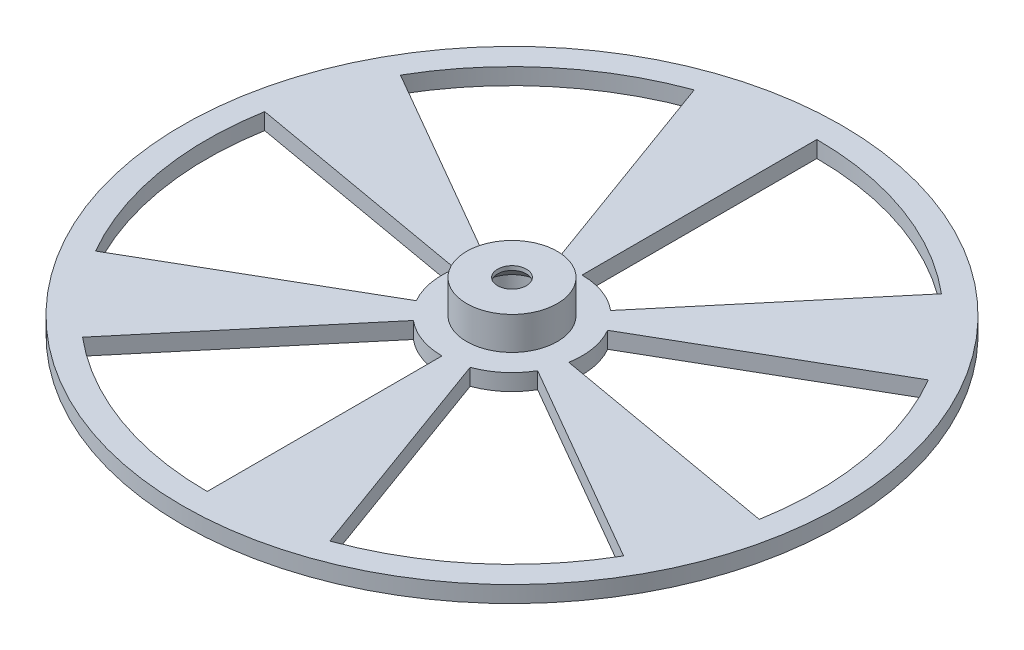
ISO-10303-21;
HEADER;
FILE_DESCRIPTION(('STEP AP214'),'2;1');
FILE_NAME('part.step','',(''),(''),'','','');
FILE_SCHEMA(('AUTOMOTIVE_DESIGN { 1 0 10303 214 1 1 1 1 }'));
ENDSEC;
DATA;
#1=APPLICATION_CONTEXT('core data for automotive mechanical design processes');
#2=APPLICATION_PROTOCOL_DEFINITION('international standard','automotive_design',2000,#1);
#3=PRODUCT_CONTEXT('',#1,'mechanical');
#4=PRODUCT('Part','Part','',(#3));
#5=PRODUCT_RELATED_PRODUCT_CATEGORY('part','',(#4));
#6=PRODUCT_DEFINITION_FORMATION('','',#4);
#7=PRODUCT_DEFINITION_CONTEXT('part definition',#1,'design');
#8=PRODUCT_DEFINITION('design','',#6,#7);
#9=PRODUCT_DEFINITION_SHAPE('','',#8);
#10=(LENGTH_UNIT() NAMED_UNIT(*) SI_UNIT(.MILLI.,.METRE.));
#11=(NAMED_UNIT(*) PLANE_ANGLE_UNIT() SI_UNIT($,.RADIAN.));
#12=(NAMED_UNIT(*) SI_UNIT($,.STERADIAN.) SOLID_ANGLE_UNIT());
#13=UNCERTAINTY_MEASURE_WITH_UNIT(LENGTH_MEASURE(1.E-05),#10,'distance_accuracy_value','');
#14=(GEOMETRIC_REPRESENTATION_CONTEXT(3) GLOBAL_UNCERTAINTY_ASSIGNED_CONTEXT((#13)) GLOBAL_UNIT_ASSIGNED_CONTEXT((#10,
#11,#12)) REPRESENTATION_CONTEXT('',''));
#15=CARTESIAN_POINT('',(0.,0.,0.));
#16=DIRECTION('',(0.,0.,1.));
#17=DIRECTION('',(1.,0.,0.));
#18=AXIS2_PLACEMENT_3D('',#15,#16,#17);
#19=CARTESIAN_POINT('',(0.,0.,0.));
#20=DIRECTION('',(0.,1.,0.));
#21=DIRECTION('',(0.,0.,1.));
#22=AXIS2_PLACEMENT_3D('',#19,#20,#21);
#23=CYLINDRICAL_SURFACE('',#22,1.75);
#24=CARTESIAN_POINT('',(0.,5.50000000000001,0.));
#25=DIRECTION('',(0.,-1.,0.));
#26=DIRECTION('',(0.,0.,-1.));
#27=AXIS2_PLACEMENT_3D('',#24,#25,#26);
#28=CIRCLE('',#27,1.75);
#29=CARTESIAN_POINT('',(0.,5.50000000000001,-1.75));
#30=VERTEX_POINT('',#29);
#31=EDGE_CURVE('E50',#30,#30,#28,.T.);
#32=ORIENTED_EDGE('',*,*,#31,.T.);
#33=EDGE_LOOP('',(#32));
#34=FACE_BOUND('',#33,.T.);
#35=CARTESIAN_POINT('',(0.,6.,0.));
#36=DIRECTION('',(0.,1.,0.));
#37=DIRECTION('',(0.,0.,1.));
#38=AXIS2_PLACEMENT_3D('',#35,#36,#37);
#39=CIRCLE('',#38,1.75);
#40=CARTESIAN_POINT('',(0.,6.,1.75));
#41=VERTEX_POINT('',#40);
#42=EDGE_CURVE('E478',#41,#41,#39,.T.);
#43=ORIENTED_EDGE('',*,*,#42,.T.);
#44=EDGE_LOOP('',(#43));
#45=FACE_BOUND('',#44,.T.);
#46=ADVANCED_FACE('F40',(#34,#45),#23,.F.);
#47=CARTESIAN_POINT('',(0.,2.,0.));
#48=DIRECTION('',(0.,-1.,0.));
#49=DIRECTION('',(0.,0.,-1.));
#50=AXIS2_PLACEMENT_3D('',#47,#48,#49);
#51=CYLINDRICAL_SURFACE('',#50,40.);
#52=CARTESIAN_POINT('',(0.,2.,0.));
#53=DIRECTION('',(0.,1.,0.));
#54=DIRECTION('',(0.,0.,1.));
#55=AXIS2_PLACEMENT_3D('',#52,#53,#54);
#56=CIRCLE('',#55,40.);
#57=CARTESIAN_POINT('',(0.,2.,40.));
#58=VERTEX_POINT('',#57);
#59=EDGE_CURVE('E491',#58,#58,#56,.T.);
#60=ORIENTED_EDGE('',*,*,#59,.F.);
#61=EDGE_LOOP('',(#60));
#62=FACE_BOUND('',#61,.T.);
#63=CARTESIAN_POINT('',(0.,0.,0.));
#64=DIRECTION('',(0.,1.,0.));
#65=DIRECTION('',(0.,0.,1.));
#66=AXIS2_PLACEMENT_3D('',#63,#64,#65);
#67=CIRCLE('',#66,40.);
#68=CARTESIAN_POINT('',(0.,0.,40.));
#69=VERTEX_POINT('',#68);
#70=EDGE_CURVE('E487',#69,#69,#67,.T.);
#71=ORIENTED_EDGE('',*,*,#70,.T.);
#72=EDGE_LOOP('',(#71));
#73=FACE_BOUND('',#72,.T.);
#74=ADVANCED_FACE('F523',(#62,#73),#51,.T.);
#75=CARTESIAN_POINT('',(0.,2.,0.));
#76=DIRECTION('',(0.,1.,0.));
#77=DIRECTION('',(0.,0.,1.));
#78=AXIS2_PLACEMENT_3D('',#75,#76,#77);
#79=PLANE('',#78);
#80=CARTESIAN_POINT('',(0.,2.,0.));
#81=DIRECTION('',(0.,-1.,0.));
#82=DIRECTION('',(0.,0.,1.));
#83=AXIS2_PLACEMENT_3D('',#80,#81,#82);
#84=CIRCLE('',#83,8.5);
#85=CARTESIAN_POINT('',(0.,2.,8.5));
#86=VERTEX_POINT('',#85);
#87=CARTESIAN_POINT('',(-5.46369468233555,2.,6.51137776651135));
#88=VERTEX_POINT('',#87);
#89=EDGE_CURVE('E57',#86,#88,#84,.T.);
#90=ORIENTED_EDGE('',*,*,#89,.F.);
#91=DIRECTION('',(0.,0.,-1.));
#92=VECTOR('',#91,1.);
#93=CARTESIAN_POINT('',(0.,2.,8.5));
#94=LINE('',#93,#92);
#95=CARTESIAN_POINT('',(-2.58369619074392E-13,2.,37.));
#96=VERTEX_POINT('',#95);
#97=EDGE_CURVE('E305',#96,#86,#94,.T.);
#98=ORIENTED_EDGE('',*,*,#97,.F.);
#99=CARTESIAN_POINT('',(0.,2.,0.));
#100=DIRECTION('',(0.,1.,0.));
#101=DIRECTION('',(0.,0.,1.));
#102=AXIS2_PLACEMENT_3D('',#99,#100,#101);
#103=CIRCLE('',#102,37.);
#104=CARTESIAN_POINT('',(-23.7831415584018,2.,28.3436443954023));
#105=VERTEX_POINT('',#104);
#106=EDGE_CURVE('E324',#105,#96,#103,.T.);
#107=ORIENTED_EDGE('',*,*,#106,.F.);
#108=DIRECTION('',(-0.642787609686535,0.,0.766044443118982));
#109=VECTOR('',#108,1.);
#110=CARTESIAN_POINT('',(-23.7831415584018,2.,28.3436443954023));
#111=LINE('',#110,#109);
#112=EDGE_CURVE('E320',#88,#105,#111,.T.);
#113=ORIENTED_EDGE('',*,*,#112,.F.);
#114=EDGE_LOOP('',(#90,#98,#107,#113));
#115=FACE_BOUND('',#114,.T.);
#116=CARTESIAN_POINT('',(0.,2.,0.));
#117=DIRECTION('',(0.,-1.,0.));
#118=DIRECTION('',(0.,0.,1.));
#119=AXIS2_PLACEMENT_3D('',#116,#117,#118);
#120=CIRCLE('',#119,8.5);
#121=CARTESIAN_POINT('',(-7.36121593216777,2.,4.24999999999993));
#122=VERTEX_POINT('',#121);
#123=CARTESIAN_POINT('',(-8.37086590060378,2.,-1.47600951016885));
#124=VERTEX_POINT('',#123);
#125=EDGE_CURVE('E65',#122,#124,#120,.T.);
#126=ORIENTED_EDGE('',*,*,#125,.F.);
#127=DIRECTION('',(0.866025403784443,0.,-0.499999999999992));
#128=VECTOR('',#127,1.);
#129=CARTESIAN_POINT('',(-7.36121593216777,2.,4.24999999999993));
#130=LINE('',#129,#128);
#131=CARTESIAN_POINT('',(-32.0429399400244,2.,18.4999999999997));
#132=VERTEX_POINT('',#131);
#133=EDGE_CURVE('E263',#132,#122,#130,.T.);
#134=ORIENTED_EDGE('',*,*,#133,.F.);
#135=CARTESIAN_POINT('',(0.,2.,0.));
#136=DIRECTION('',(0.,1.,0.));
#137=DIRECTION('',(0.,0.,1.));
#138=AXIS2_PLACEMENT_3D('',#135,#136,#137);
#139=CIRCLE('',#138,37.);
#140=CARTESIAN_POINT('',(-36.4378868614517,2.,-6.42498257367619));
#141=VERTEX_POINT('',#140);
#142=EDGE_CURVE('E282',#141,#132,#139,.T.);
#143=ORIENTED_EDGE('',*,*,#142,.F.);
#144=DIRECTION('',(-0.984807753012209,0.,-0.173648177666924));
#145=VECTOR('',#144,1.);
#146=CARTESIAN_POINT('',(-36.4378868614517,2.,-6.42498257367619));
#147=LINE('',#146,#145);
#148=EDGE_CURVE('E278',#124,#141,#147,.T.);
#149=ORIENTED_EDGE('',*,*,#148,.F.);
#150=EDGE_LOOP('',(#126,#134,#143,#149));
#151=FACE_BOUND('',#150,.T.);
#152=CARTESIAN_POINT('',(0.,2.,0.));
#153=DIRECTION('',(0.,-1.,0.));
#154=DIRECTION('',(0.,0.,1.));
#155=AXIS2_PLACEMENT_3D('',#152,#153,#154);
#156=CIRCLE('',#155,8.5);
#157=CARTESIAN_POINT('',(7.36121593216771,2.,4.25000000000003));
#158=VERTEX_POINT('',#157);
#159=CARTESIAN_POINT('',(2.90717121826823,2.,7.9873872766802));
#160=VERTEX_POINT('',#159);
#161=EDGE_CURVE('E334',#158,#160,#156,.T.);
#162=ORIENTED_EDGE('',*,*,#161,.F.);
#163=DIRECTION('',(-0.866025403784436,0.,-0.500000000000004));
#164=VECTOR('',#163,1.);
#165=CARTESIAN_POINT('',(7.36121593216771,2.,4.25000000000003));
#166=LINE('',#165,#164);
#167=CARTESIAN_POINT('',(32.0429399400241,2.,18.5000000000001));
#168=VERTEX_POINT('',#167);
#169=EDGE_CURVE('E394',#168,#158,#166,.T.);
#170=ORIENTED_EDGE('',*,*,#169,.F.);
#171=CARTESIAN_POINT('',(0.,2.,0.));
#172=DIRECTION('',(0.,1.,0.));
#173=DIRECTION('',(0.,0.,1.));
#174=AXIS2_PLACEMENT_3D('',#171,#172,#173);
#175=CIRCLE('',#174,37.);
#176=CARTESIAN_POINT('',(12.65474530305,2.,34.7686269690785));
#177=VERTEX_POINT('',#176);
#178=EDGE_CURVE('E413',#177,#168,#175,.T.);
#179=ORIENTED_EDGE('',*,*,#178,.F.);
#180=DIRECTION('',(0.342020143325674,0.,0.939692620785906));
#181=VECTOR('',#180,1.);
#182=CARTESIAN_POINT('',(12.65474530305,2.,34.7686269690785));
#183=LINE('',#182,#181);
#184=EDGE_CURVE('E409',#160,#177,#183,.T.);
#185=ORIENTED_EDGE('',*,*,#184,.F.);
#186=EDGE_LOOP('',(#162,#170,#179,#185));
#187=FACE_BOUND('',#186,.T.);
#188=CARTESIAN_POINT('',(0.,2.,0.));
#189=DIRECTION('',(0.,-1.,0.));
#190=DIRECTION('',(0.,0.,1.));
#191=AXIS2_PLACEMENT_3D('',#188,#189,#190);
#192=CIRCLE('',#191,8.5);
#193=CARTESIAN_POINT('',(0.,2.,-8.5));
#194=VERTEX_POINT('',#193);
#195=CARTESIAN_POINT('',(5.46369468233554,2.,-6.51137776651135));
#196=VERTEX_POINT('',#195);
#197=EDGE_CURVE('E361',#194,#196,#192,.T.);
#198=ORIENTED_EDGE('',*,*,#197,.F.);
#199=DIRECTION('',(0.,0.,1.));
#200=VECTOR('',#199,1.);
#201=CARTESIAN_POINT('',(0.,2.,-8.5));
#202=LINE('',#201,#200);
#203=CARTESIAN_POINT('',(0.,2.,-37.));
#204=VERTEX_POINT('',#203);
#205=EDGE_CURVE('E348',#204,#194,#202,.T.);
#206=ORIENTED_EDGE('',*,*,#205,.F.);
#207=CARTESIAN_POINT('',(0.,2.,0.));
#208=DIRECTION('',(0.,1.,0.));
#209=DIRECTION('',(0.,0.,1.));
#210=AXIS2_PLACEMENT_3D('',#207,#208,#209);
#211=CIRCLE('',#210,37.);
#212=CARTESIAN_POINT('',(23.7831415584018,2.,-28.3436443954023));
#213=VERTEX_POINT('',#212);
#214=EDGE_CURVE('E369',#213,#204,#211,.T.);
#215=ORIENTED_EDGE('',*,*,#214,.F.);
#216=DIRECTION('',(0.642787609686535,0.,-0.766044443118982));
#217=VECTOR('',#216,1.);
#218=CARTESIAN_POINT('',(23.7831415584018,2.,-28.3436443954023));
#219=LINE('',#218,#217);
#220=EDGE_CURVE('E364',#196,#213,#219,.T.);
#221=ORIENTED_EDGE('',*,*,#220,.F.);
#222=EDGE_LOOP('',(#198,#206,#215,#221));
#223=FACE_BOUND('',#222,.T.);
#224=CARTESIAN_POINT('',(0.,2.,0.));
#225=DIRECTION('',(0.,-1.,0.));
#226=DIRECTION('',(0.,0.,1.));
#227=AXIS2_PLACEMENT_3D('',#224,#225,#226);
#228=CIRCLE('',#227,8.5);
#229=CARTESIAN_POINT('',(-7.36121593216768,2.,-4.25000000000009));
#230=VERTEX_POINT('',#229);
#231=CARTESIAN_POINT('',(-2.90717121826824,2.,-7.9873872766802));
#232=VERTEX_POINT('',#231);
#233=EDGE_CURVE('E210',#230,#232,#228,.T.);
#234=ORIENTED_EDGE('',*,*,#233,.F.);
#235=DIRECTION('',(0.866025403784433,0.,0.50000000000001));
#236=VECTOR('',#235,1.);
#237=CARTESIAN_POINT('',(-7.36121593216768,2.,-4.25000000000009));
#238=LINE('',#237,#236);
#239=CARTESIAN_POINT('',(-32.042939940024,2.,-18.5000000000004));
#240=VERTEX_POINT('',#239);
#241=EDGE_CURVE('E231',#240,#230,#238,.T.);
#242=ORIENTED_EDGE('',*,*,#241,.F.);
#243=CARTESIAN_POINT('',(0.,2.,0.));
#244=DIRECTION('',(0.,1.,0.));
#245=DIRECTION('',(0.,0.,1.));
#246=AXIS2_PLACEMENT_3D('',#243,#244,#245);
#247=CIRCLE('',#246,37.);
#248=CARTESIAN_POINT('',(-12.65474530305,2.,-34.7686269690785));
#249=VERTEX_POINT('',#248);
#250=EDGE_CURVE('E235',#249,#240,#247,.T.);
#251=ORIENTED_EDGE('',*,*,#250,.F.);
#252=DIRECTION('',(-0.342020143325675,0.,-0.939692620785906));
#253=VECTOR('',#252,1.);
#254=CARTESIAN_POINT('',(-12.65474530305,2.,-34.7686269690785));
#255=LINE('',#254,#253);
#256=EDGE_CURVE('E244',#232,#249,#255,.T.);
#257=ORIENTED_EDGE('',*,*,#256,.F.);
#258=EDGE_LOOP('',(#234,#242,#251,#257));
#259=FACE_BOUND('',#258,.T.);
#260=CARTESIAN_POINT('',(0.,2.,0.));
#261=DIRECTION('',(0.,-1.,0.));
#262=DIRECTION('',(0.,0.,1.));
#263=AXIS2_PLACEMENT_3D('',#260,#261,#262);
#264=CIRCLE('',#263,8.5);
#265=CARTESIAN_POINT('',(7.36121593216774,2.,-4.24999999999998));
#266=VERTEX_POINT('',#265);
#267=CARTESIAN_POINT('',(8.37086590060378,2.,1.47600951016886));
#268=VERTEX_POINT('',#267);
#269=EDGE_CURVE('E379',#266,#268,#264,.T.);
#270=ORIENTED_EDGE('',*,*,#269,.F.);
#271=DIRECTION('',(-0.86602540378444,0.,0.499999999999998));
#272=VECTOR('',#271,1.);
#273=CARTESIAN_POINT('',(7.36121593216774,2.,-4.24999999999998));
#274=LINE('',#273,#272);
#275=CARTESIAN_POINT('',(32.0429399400243,2.,-18.4999999999999));
#276=VERTEX_POINT('',#275);
#277=EDGE_CURVE('E436',#276,#266,#274,.T.);
#278=ORIENTED_EDGE('',*,*,#277,.F.);
#279=CARTESIAN_POINT('',(0.,2.,0.));
#280=DIRECTION('',(0.,1.,0.));
#281=DIRECTION('',(0.,0.,1.));
#282=AXIS2_PLACEMENT_3D('',#279,#280,#281);
#283=CIRCLE('',#282,37.);
#284=CARTESIAN_POINT('',(36.4378868614517,2.,6.4249825736762));
#285=VERTEX_POINT('',#284);
#286=EDGE_CURVE('E455',#285,#276,#283,.T.);
#287=ORIENTED_EDGE('',*,*,#286,.F.);
#288=DIRECTION('',(0.984807753012209,0.,0.173648177666924));
#289=VECTOR('',#288,1.);
#290=CARTESIAN_POINT('',(36.4378868614517,2.,6.4249825736762));
#291=LINE('',#290,#289);
#292=EDGE_CURVE('E451',#268,#285,#291,.T.);
#293=ORIENTED_EDGE('',*,*,#292,.F.);
#294=EDGE_LOOP('',(#270,#278,#287,#293));
#295=FACE_BOUND('',#294,.T.);
#296=CARTESIAN_POINT('',(0.,2.,0.));
#297=DIRECTION('',(0.,1.,0.));
#298=DIRECTION('',(0.,0.,1.));
#299=AXIS2_PLACEMENT_3D('',#296,#297,#298);
#300=CIRCLE('',#299,5.5);
#301=CARTESIAN_POINT('',(0.,2.,5.5));
#302=VERTEX_POINT('',#301);
#303=EDGE_CURVE('E482',#302,#302,#300,.T.);
#304=ORIENTED_EDGE('',*,*,#303,.F.);
#305=EDGE_LOOP('',(#304));
#306=FACE_BOUND('',#305,.T.);
#307=ORIENTED_EDGE('',*,*,#59,.T.);
#308=EDGE_LOOP('',(#307));
#309=FACE_BOUND('',#308,.T.);
#310=ADVANCED_FACE('F518',(#115,#151,#187,#223,#259,#295,#306,#309),#79,.T.);
#311=CARTESIAN_POINT('',(0.,0.,0.));
#312=DIRECTION('',(0.,1.,0.));
#313=DIRECTION('',(0.,0.,1.));
#314=AXIS2_PLACEMENT_3D('',#311,#312,#313);
#315=PLANE('',#314);
#316=DIRECTION('',(0.,0.,-1.));
#317=VECTOR('',#316,1.);
#318=CARTESIAN_POINT('',(0.,0.,8.5));
#319=LINE('',#318,#317);
#320=CARTESIAN_POINT('',(-2.58369619074392E-13,0.,37.));
#321=VERTEX_POINT('',#320);
#322=CARTESIAN_POINT('',(0.,0.,8.5));
#323=VERTEX_POINT('',#322);
#324=EDGE_CURVE('E313',#321,#323,#319,.T.);
#325=ORIENTED_EDGE('',*,*,#324,.T.);
#326=CARTESIAN_POINT('',(0.,0.,0.));
#327=DIRECTION('',(0.,-1.,0.));
#328=DIRECTION('',(0.,0.,1.));
#329=AXIS2_PLACEMENT_3D('',#326,#327,#328);
#330=CIRCLE('',#329,8.5);
#331=CARTESIAN_POINT('',(-5.46369468233555,0.,6.51137776651135));
#332=VERTEX_POINT('',#331);
#333=EDGE_CURVE('E300',#323,#332,#330,.T.);
#334=ORIENTED_EDGE('',*,*,#333,.T.);
#335=DIRECTION('',(-0.642787609686535,0.,0.766044443118982));
#336=VECTOR('',#335,1.);
#337=CARTESIAN_POINT('',(-23.7831415584018,0.,28.3436443954023));
#338=LINE('',#337,#336);
#339=CARTESIAN_POINT('',(-23.7831415584018,0.,28.3436443954023));
#340=VERTEX_POINT('',#339);
#341=EDGE_CURVE('E304',#332,#340,#338,.T.);
#342=ORIENTED_EDGE('',*,*,#341,.T.);
#343=CARTESIAN_POINT('',(0.,0.,0.));
#344=DIRECTION('',(0.,1.,0.));
#345=DIRECTION('',(0.,0.,1.));
#346=AXIS2_PLACEMENT_3D('',#343,#344,#345);
#347=CIRCLE('',#346,37.);
#348=EDGE_CURVE('E309',#340,#321,#347,.T.);
#349=ORIENTED_EDGE('',*,*,#348,.T.);
#350=EDGE_LOOP('',(#325,#334,#342,#349));
#351=FACE_BOUND('',#350,.T.);
#352=DIRECTION('',(0.866025403784443,0.,-0.499999999999992));
#353=VECTOR('',#352,1.);
#354=CARTESIAN_POINT('',(-7.36121593216777,0.,4.24999999999993));
#355=LINE('',#354,#353);
#356=CARTESIAN_POINT('',(-32.0429399400244,0.,18.4999999999997));
#357=VERTEX_POINT('',#356);
#358=CARTESIAN_POINT('',(-7.36121593216777,0.,4.24999999999993));
#359=VERTEX_POINT('',#358);
#360=EDGE_CURVE('E271',#357,#359,#355,.T.);
#361=ORIENTED_EDGE('',*,*,#360,.T.);
#362=CARTESIAN_POINT('',(0.,0.,0.));
#363=DIRECTION('',(0.,-1.,0.));
#364=DIRECTION('',(0.,0.,1.));
#365=AXIS2_PLACEMENT_3D('',#362,#363,#364);
#366=CIRCLE('',#365,8.5);
#367=CARTESIAN_POINT('',(-8.37086590060378,0.,-1.47600951016886));
#368=VERTEX_POINT('',#367);
#369=EDGE_CURVE('E258',#359,#368,#366,.T.);
#370=ORIENTED_EDGE('',*,*,#369,.T.);
#371=DIRECTION('',(-0.984807753012209,0.,-0.173648177666924));
#372=VECTOR('',#371,1.);
#373=CARTESIAN_POINT('',(-36.4378868614517,0.,-6.42498257367619));
#374=LINE('',#373,#372);
#375=CARTESIAN_POINT('',(-36.4378868614517,0.,-6.42498257367619));
#376=VERTEX_POINT('',#375);
#377=EDGE_CURVE('E262',#368,#376,#374,.T.);
#378=ORIENTED_EDGE('',*,*,#377,.T.);
#379=CARTESIAN_POINT('',(0.,0.,0.));
#380=DIRECTION('',(0.,1.,0.));
#381=DIRECTION('',(0.,0.,1.));
#382=AXIS2_PLACEMENT_3D('',#379,#380,#381);
#383=CIRCLE('',#382,37.);
#384=EDGE_CURVE('E267',#376,#357,#383,.T.);
#385=ORIENTED_EDGE('',*,*,#384,.T.);
#386=EDGE_LOOP('',(#361,#370,#378,#385));
#387=FACE_BOUND('',#386,.T.);
#388=DIRECTION('',(-0.866025403784436,0.,-0.500000000000004));
#389=VECTOR('',#388,1.);
#390=CARTESIAN_POINT('',(7.36121593216771,0.,4.25000000000003));
#391=LINE('',#390,#389);
#392=CARTESIAN_POINT('',(32.0429399400241,0.,18.5000000000001));
#393=VERTEX_POINT('',#392);
#394=CARTESIAN_POINT('',(7.36121593216771,0.,4.25000000000003));
#395=VERTEX_POINT('',#394);
#396=EDGE_CURVE('E402',#393,#395,#391,.T.);
#397=ORIENTED_EDGE('',*,*,#396,.T.);
#398=CARTESIAN_POINT('',(0.,0.,0.));
#399=DIRECTION('',(0.,-1.,0.));
#400=DIRECTION('',(0.,0.,1.));
#401=AXIS2_PLACEMENT_3D('',#398,#399,#400);
#402=CIRCLE('',#401,8.5);
#403=CARTESIAN_POINT('',(2.90717121826823,0.,7.9873872766802));
#404=VERTEX_POINT('',#403);
#405=EDGE_CURVE('E389',#395,#404,#402,.T.);
#406=ORIENTED_EDGE('',*,*,#405,.T.);
#407=DIRECTION('',(0.342020143325674,0.,0.939692620785906));
#408=VECTOR('',#407,1.);
#409=CARTESIAN_POINT('',(12.65474530305,0.,34.7686269690785));
#410=LINE('',#409,#408);
#411=CARTESIAN_POINT('',(12.65474530305,0.,34.7686269690785));
#412=VERTEX_POINT('',#411);
#413=EDGE_CURVE('E393',#404,#412,#410,.T.);
#414=ORIENTED_EDGE('',*,*,#413,.T.);
#415=CARTESIAN_POINT('',(0.,0.,0.));
#416=DIRECTION('',(0.,1.,0.));
#417=DIRECTION('',(0.,0.,1.));
#418=AXIS2_PLACEMENT_3D('',#415,#416,#417);
#419=CIRCLE('',#418,37.);
#420=EDGE_CURVE('E398',#412,#393,#419,.T.);
#421=ORIENTED_EDGE('',*,*,#420,.T.);
#422=EDGE_LOOP('',(#397,#406,#414,#421));
#423=FACE_BOUND('',#422,.T.);
#424=DIRECTION('',(0.,0.,1.));
#425=VECTOR('',#424,1.);
#426=CARTESIAN_POINT('',(0.,0.,-8.5));
#427=LINE('',#426,#425);
#428=CARTESIAN_POINT('',(0.,0.,-37.));
#429=VERTEX_POINT('',#428);
#430=CARTESIAN_POINT('',(0.,0.,-8.5));
#431=VERTEX_POINT('',#430);
#432=EDGE_CURVE('E356',#429,#431,#427,.T.);
#433=ORIENTED_EDGE('',*,*,#432,.T.);
#434=CARTESIAN_POINT('',(0.,0.,0.));
#435=DIRECTION('',(0.,-1.,0.));
#436=DIRECTION('',(0.,0.,1.));
#437=AXIS2_PLACEMENT_3D('',#434,#435,#436);
#438=CIRCLE('',#437,8.5);
#439=CARTESIAN_POINT('',(5.46369468233555,0.,-6.51137776651135));
#440=VERTEX_POINT('',#439);
#441=EDGE_CURVE('E343',#431,#440,#438,.T.);
#442=ORIENTED_EDGE('',*,*,#441,.T.);
#443=DIRECTION('',(0.642787609686535,0.,-0.766044443118982));
#444=VECTOR('',#443,1.);
#445=CARTESIAN_POINT('',(23.7831415584018,0.,-28.3436443954023));
#446=LINE('',#445,#444);
#447=CARTESIAN_POINT('',(23.7831415584018,0.,-28.3436443954023));
#448=VERTEX_POINT('',#447);
#449=EDGE_CURVE('E347',#440,#448,#446,.T.);
#450=ORIENTED_EDGE('',*,*,#449,.T.);
#451=CARTESIAN_POINT('',(0.,0.,0.));
#452=DIRECTION('',(0.,1.,0.));
#453=DIRECTION('',(0.,0.,1.));
#454=AXIS2_PLACEMENT_3D('',#451,#452,#453);
#455=CIRCLE('',#454,37.);
#456=EDGE_CURVE('E352',#448,#429,#455,.T.);
#457=ORIENTED_EDGE('',*,*,#456,.T.);
#458=EDGE_LOOP('',(#433,#442,#450,#457));
#459=FACE_BOUND('',#458,.T.);
#460=DIRECTION('',(0.866025403784433,0.,0.50000000000001));
#461=VECTOR('',#460,1.);
#462=CARTESIAN_POINT('',(-7.36121593216768,0.,-4.25000000000009));
#463=LINE('',#462,#461);
#464=CARTESIAN_POINT('',(-32.042939940024,0.,-18.5000000000004));
#465=VERTEX_POINT('',#464);
#466=CARTESIAN_POINT('',(-7.36121593216768,0.,-4.25000000000009));
#467=VERTEX_POINT('',#466);
#468=EDGE_CURVE('E216',#465,#467,#463,.T.);
#469=ORIENTED_EDGE('',*,*,#468,.T.);
#470=CARTESIAN_POINT('',(0.,0.,0.));
#471=DIRECTION('',(0.,-1.,0.));
#472=DIRECTION('',(0.,0.,1.));
#473=AXIS2_PLACEMENT_3D('',#470,#471,#472);
#474=CIRCLE('',#473,8.5);
#475=CARTESIAN_POINT('',(-2.90717121826824,0.,-7.9873872766802));
#476=VERTEX_POINT('',#475);
#477=EDGE_CURVE('E207',#467,#476,#474,.T.);
#478=ORIENTED_EDGE('',*,*,#477,.T.);
#479=DIRECTION('',(-0.342020143325675,0.,-0.939692620785906));
#480=VECTOR('',#479,1.);
#481=CARTESIAN_POINT('',(-12.65474530305,0.,-34.7686269690785));
#482=LINE('',#481,#480);
#483=CARTESIAN_POINT('',(-12.65474530305,0.,-34.7686269690785));
#484=VERTEX_POINT('',#483);
#485=EDGE_CURVE('E220',#476,#484,#482,.T.);
#486=ORIENTED_EDGE('',*,*,#485,.T.);
#487=CARTESIAN_POINT('',(0.,0.,0.));
#488=DIRECTION('',(0.,1.,0.));
#489=DIRECTION('',(0.,0.,1.));
#490=AXIS2_PLACEMENT_3D('',#487,#488,#489);
#491=CIRCLE('',#490,37.);
#492=EDGE_CURVE('E225',#484,#465,#491,.T.);
#493=ORIENTED_EDGE('',*,*,#492,.T.);
#494=EDGE_LOOP('',(#469,#478,#486,#493));
#495=FACE_BOUND('',#494,.T.);
#496=DIRECTION('',(-0.86602540378444,0.,0.499999999999998));
#497=VECTOR('',#496,1.);
#498=CARTESIAN_POINT('',(7.36121593216774,0.,-4.24999999999998));
#499=LINE('',#498,#497);
#500=CARTESIAN_POINT('',(32.0429399400243,0.,-18.4999999999999));
#501=VERTEX_POINT('',#500);
#502=CARTESIAN_POINT('',(7.36121593216774,0.,-4.24999999999998));
#503=VERTEX_POINT('',#502);
#504=EDGE_CURVE('E444',#501,#503,#499,.T.);
#505=ORIENTED_EDGE('',*,*,#504,.T.);
#506=CARTESIAN_POINT('',(0.,0.,0.));
#507=DIRECTION('',(0.,-1.,0.));
#508=DIRECTION('',(0.,0.,1.));
#509=AXIS2_PLACEMENT_3D('',#506,#507,#508);
#510=CIRCLE('',#509,8.5);
#511=CARTESIAN_POINT('',(8.37086590060378,0.,1.47600951016886));
#512=VERTEX_POINT('',#511);
#513=EDGE_CURVE('E431',#503,#512,#510,.T.);
#514=ORIENTED_EDGE('',*,*,#513,.T.);
#515=DIRECTION('',(0.984807753012209,0.,0.173648177666924));
#516=VECTOR('',#515,1.);
#517=CARTESIAN_POINT('',(36.4378868614517,0.,6.4249825736762));
#518=LINE('',#517,#516);
#519=CARTESIAN_POINT('',(36.4378868614517,0.,6.4249825736762));
#520=VERTEX_POINT('',#519);
#521=EDGE_CURVE('E435',#512,#520,#518,.T.);
#522=ORIENTED_EDGE('',*,*,#521,.T.);
#523=CARTESIAN_POINT('',(0.,0.,0.));
#524=DIRECTION('',(0.,1.,0.));
#525=DIRECTION('',(0.,0.,1.));
#526=AXIS2_PLACEMENT_3D('',#523,#524,#525);
#527=CIRCLE('',#526,37.);
#528=EDGE_CURVE('E440',#520,#501,#527,.T.);
#529=ORIENTED_EDGE('',*,*,#528,.T.);
#530=EDGE_LOOP('',(#505,#514,#522,#529));
#531=FACE_BOUND('',#530,.T.);
#532=CARTESIAN_POINT('',(0.,0.,0.));
#533=DIRECTION('',(0.,-1.,0.));
#534=DIRECTION('',(0.,0.,-1.));
#535=AXIS2_PLACEMENT_3D('',#532,#533,#534);
#536=CIRCLE('',#535,3.25);
#537=CARTESIAN_POINT('',(0.,0.,-3.25));
#538=VERTEX_POINT('',#537);
#539=EDGE_CURVE('E465',#538,#538,#536,.T.);
#540=ORIENTED_EDGE('',*,*,#539,.F.);
#541=EDGE_LOOP('',(#540));
#542=FACE_BOUND('',#541,.T.);
#543=ORIENTED_EDGE('',*,*,#70,.F.);
#544=EDGE_LOOP('',(#543));
#545=FACE_BOUND('',#544,.T.);
#546=ADVANCED_FACE('F227',(#351,#387,#423,#459,#495,#531,#542,#545),#315,.F.);
#547=CARTESIAN_POINT('',(0.,6.,0.));
#548=DIRECTION('',(0.,-1.,0.));
#549=DIRECTION('',(0.,0.,-1.));
#550=AXIS2_PLACEMENT_3D('',#547,#548,#549);
#551=CYLINDRICAL_SURFACE('',#550,5.5);
#552=CARTESIAN_POINT('',(0.,6.,0.));
#553=DIRECTION('',(0.,1.,0.));
#554=DIRECTION('',(0.,0.,1.));
#555=AXIS2_PLACEMENT_3D('',#552,#553,#554);
#556=CIRCLE('',#555,5.5);
#557=CARTESIAN_POINT('',(0.,6.,5.5));
#558=VERTEX_POINT('',#557);
#559=EDGE_CURVE('E483',#558,#558,#556,.T.);
#560=ORIENTED_EDGE('',*,*,#559,.F.);
#561=EDGE_LOOP('',(#560));
#562=FACE_BOUND('',#561,.T.);
#563=ORIENTED_EDGE('',*,*,#303,.T.);
#564=EDGE_LOOP('',(#563));
#565=FACE_BOUND('',#564,.T.);
#566=ADVANCED_FACE('F517',(#562,#565),#551,.T.);
#567=CARTESIAN_POINT('',(0.,6.,0.));
#568=DIRECTION('',(0.,1.,0.));
#569=DIRECTION('',(0.,0.,1.));
#570=AXIS2_PLACEMENT_3D('',#567,#568,#569);
#571=PLANE('',#570);
#572=ORIENTED_EDGE('',*,*,#42,.F.);
#573=EDGE_LOOP('',(#572));
#574=FACE_BOUND('',#573,.T.);
#575=ORIENTED_EDGE('',*,*,#559,.T.);
#576=EDGE_LOOP('',(#575));
#577=FACE_BOUND('',#576,.T.);
#578=ADVANCED_FACE('F511',(#574,#577),#571,.T.);
#579=CARTESIAN_POINT('',(0.,3.5,0.));
#580=DIRECTION('',(0.,-1.,0.));
#581=DIRECTION('',(0.,0.,-1.));
#582=AXIS2_PLACEMENT_3D('',#579,#580,#581);
#583=CYLINDRICAL_SURFACE('',#582,3.25);
#584=CARTESIAN_POINT('',(0.,4.00000000000003,0.));
#585=DIRECTION('',(0.,-1.,0.));
#586=DIRECTION('',(0.,0.,-1.));
#587=AXIS2_PLACEMENT_3D('',#584,#585,#586);
#588=CIRCLE('',#587,3.25);
#589=CARTESIAN_POINT('',(0.,4.00000000000003,-3.25));
#590=VERTEX_POINT('',#589);
#591=EDGE_CURVE('E11',#590,#590,#588,.F.);
#592=ORIENTED_EDGE('',*,*,#591,.T.);
#593=EDGE_LOOP('',(#592));
#594=FACE_BOUND('',#593,.T.);
#595=ORIENTED_EDGE('',*,*,#539,.T.);
#596=EDGE_LOOP('',(#595));
#597=FACE_BOUND('',#596,.T.);
#598=ADVANCED_FACE('F506',(#594,#597),#583,.F.);
#599=CARTESIAN_POINT('',(0.,3.5,0.));
#600=DIRECTION('',(0.,-1.,0.));
#601=DIRECTION('',(0.,0.,-1.));
#602=AXIS2_PLACEMENT_3D('',#599,#600,#601);
#603=CONICAL_SURFACE('',#602,3.75000000000004,0.785398163397454);
#604=ORIENTED_EDGE('',*,*,#31,.F.);
#605=EDGE_LOOP('',(#604));
#606=FACE_BOUND('',#605,.T.);
#607=ORIENTED_EDGE('',*,*,#591,.F.);
#608=EDGE_LOOP('',(#607));
#609=FACE_BOUND('',#608,.T.);
#610=ADVANCED_FACE('F43',(#606,#609),#603,.F.);
#611=CARTESIAN_POINT('',(0.,0.,0.));
#612=DIRECTION('',(0.,1.,0.));
#613=DIRECTION('',(0.,0.,1.));
#614=AXIS2_PLACEMENT_3D('',#611,#612,#613);
#615=CYLINDRICAL_SURFACE('',#614,8.5);
#616=ORIENTED_EDGE('',*,*,#269,.T.);
#617=DIRECTION('',(0.,1.,0.));
#618=VECTOR('',#617,1.);
#619=CARTESIAN_POINT('',(8.37086590060378,0.,1.47600951016886));
#620=LINE('',#619,#618);
#621=EDGE_CURVE('E448',#512,#268,#620,.T.);
#622=ORIENTED_EDGE('',*,*,#621,.F.);
#623=ORIENTED_EDGE('',*,*,#513,.F.);
#624=DIRECTION('',(0.,1.,0.));
#625=VECTOR('',#624,1.);
#626=CARTESIAN_POINT('',(7.36121593216774,0.,-4.24999999999998));
#627=LINE('',#626,#625);
#628=EDGE_CURVE('E462',#503,#266,#627,.T.);
#629=ORIENTED_EDGE('',*,*,#628,.T.);
#630=EDGE_LOOP('',(#616,#622,#623,#629));
#631=FACE_BOUND('',#630,.T.);
#632=ADVANCED_FACE('F505',(#631),#615,.T.);
#633=CARTESIAN_POINT('',(7.36121593216774,0.,-4.24999999999998));
#634=DIRECTION('',(-0.499999999999998,0.,-0.86602540378444));
#635=DIRECTION('',(-0.86602540378444,0.,0.499999999999998));
#636=AXIS2_PLACEMENT_3D('',#633,#634,#635);
#637=PLANE('',#636);
#638=ORIENTED_EDGE('',*,*,#277,.T.);
#639=ORIENTED_EDGE('',*,*,#628,.F.);
#640=ORIENTED_EDGE('',*,*,#504,.F.);
#641=DIRECTION('',(0.,1.,0.));
#642=VECTOR('',#641,1.);
#643=CARTESIAN_POINT('',(32.0429399400243,0.,-18.4999999999999));
#644=LINE('',#643,#642);
#645=EDGE_CURVE('E466',#501,#276,#644,.T.);
#646=ORIENTED_EDGE('',*,*,#645,.T.);
#647=EDGE_LOOP('',(#638,#639,#640,#646));
#648=FACE_BOUND('',#647,.T.);
#649=ADVANCED_FACE('F544',(#648),#637,.F.);
#650=CARTESIAN_POINT('',(0.,0.,0.));
#651=DIRECTION('',(0.,1.,0.));
#652=DIRECTION('',(0.,0.,1.));
#653=AXIS2_PLACEMENT_3D('',#650,#651,#652);
#654=CYLINDRICAL_SURFACE('',#653,37.);
#655=ORIENTED_EDGE('',*,*,#286,.T.);
#656=ORIENTED_EDGE('',*,*,#645,.F.);
#657=ORIENTED_EDGE('',*,*,#528,.F.);
#658=DIRECTION('',(0.,1.,0.));
#659=VECTOR('',#658,1.);
#660=CARTESIAN_POINT('',(36.4378868614517,0.,6.4249825736762));
#661=LINE('',#660,#659);
#662=EDGE_CURVE('E469',#520,#285,#661,.T.);
#663=ORIENTED_EDGE('',*,*,#662,.T.);
#664=EDGE_LOOP('',(#655,#656,#657,#663));
#665=FACE_BOUND('',#664,.T.);
#666=ADVANCED_FACE('F549',(#665),#654,.F.);
#667=CARTESIAN_POINT('',(36.4378868614517,0.,6.4249825736762));
#668=DIRECTION('',(-0.173648177666924,0.,0.984807753012209));
#669=DIRECTION('',(0.984807753012209,0.,0.173648177666924));
#670=AXIS2_PLACEMENT_3D('',#667,#668,#669);
#671=PLANE('',#670);
#672=ORIENTED_EDGE('',*,*,#292,.T.);
#673=ORIENTED_EDGE('',*,*,#662,.F.);
#674=ORIENTED_EDGE('',*,*,#521,.F.);
#675=ORIENTED_EDGE('',*,*,#621,.T.);
#676=EDGE_LOOP('',(#672,#673,#674,#675));
#677=FACE_BOUND('',#676,.T.);
#678=ADVANCED_FACE('F546',(#677),#671,.F.);
#679=CARTESIAN_POINT('',(0.,0.,0.));
#680=DIRECTION('',(0.,1.,0.));
#681=DIRECTION('',(0.,0.,1.));
#682=AXIS2_PLACEMENT_3D('',#679,#680,#681);
#683=CYLINDRICAL_SURFACE('',#682,8.5);
#684=ORIENTED_EDGE('',*,*,#233,.T.);
#685=DIRECTION('',(0.,1.,0.));
#686=VECTOR('',#685,1.);
#687=CARTESIAN_POINT('',(-2.90717121826824,0.,-7.9873872766802));
#688=LINE('',#687,#686);
#689=EDGE_CURVE('E203',#476,#232,#688,.T.);
#690=ORIENTED_EDGE('',*,*,#689,.F.);
#691=ORIENTED_EDGE('',*,*,#477,.F.);
#692=DIRECTION('',(0.,1.,0.));
#693=VECTOR('',#692,1.);
#694=CARTESIAN_POINT('',(-7.36121593216768,0.,-4.25000000000009));
#695=LINE('',#694,#693);
#696=EDGE_CURVE('E250',#467,#230,#695,.T.);
#697=ORIENTED_EDGE('',*,*,#696,.T.);
#698=EDGE_LOOP('',(#684,#690,#691,#697));
#699=FACE_BOUND('',#698,.T.);
#700=ADVANCED_FACE('F205',(#699),#683,.T.);
#701=CARTESIAN_POINT('',(-7.36121593216768,0.,-4.25000000000009));
#702=DIRECTION('',(-0.50000000000001,0.,0.866025403784433));
#703=DIRECTION('',(0.866025403784433,0.,0.50000000000001));
#704=AXIS2_PLACEMENT_3D('',#701,#702,#703);
#705=PLANE('',#704);
#706=ORIENTED_EDGE('',*,*,#241,.T.);
#707=ORIENTED_EDGE('',*,*,#696,.F.);
#708=ORIENTED_EDGE('',*,*,#468,.F.);
#709=DIRECTION('',(0.,1.,0.));
#710=VECTOR('',#709,1.);
#711=CARTESIAN_POINT('',(-32.042939940024,0.,-18.5000000000004));
#712=LINE('',#711,#710);
#713=EDGE_CURVE('E253',#465,#240,#712,.T.);
#714=ORIENTED_EDGE('',*,*,#713,.T.);
#715=EDGE_LOOP('',(#706,#707,#708,#714));
#716=FACE_BOUND('',#715,.T.);
#717=ADVANCED_FACE('F621',(#716),#705,.F.);
#718=CARTESIAN_POINT('',(0.,0.,0.));
#719=DIRECTION('',(0.,1.,0.));
#720=DIRECTION('',(0.,0.,1.));
#721=AXIS2_PLACEMENT_3D('',#718,#719,#720);
#722=CYLINDRICAL_SURFACE('',#721,37.);
#723=ORIENTED_EDGE('',*,*,#250,.T.);
#724=ORIENTED_EDGE('',*,*,#713,.F.);
#725=ORIENTED_EDGE('',*,*,#492,.F.);
#726=DIRECTION('',(0.,1.,0.));
#727=VECTOR('',#726,1.);
#728=CARTESIAN_POINT('',(-12.65474530305,0.,-34.7686269690785));
#729=LINE('',#728,#727);
#730=EDGE_CURVE('E215',#484,#249,#729,.T.);
#731=ORIENTED_EDGE('',*,*,#730,.T.);
#732=EDGE_LOOP('',(#723,#724,#725,#731));
#733=FACE_BOUND('',#732,.T.);
#734=ADVANCED_FACE('F624',(#733),#722,.F.);
#735=CARTESIAN_POINT('',(-12.65474530305,0.,-34.7686269690785));
#736=DIRECTION('',(0.939692620785906,0.,-0.342020143325675));
#737=DIRECTION('',(-0.342020143325675,0.,-0.939692620785906));
#738=AXIS2_PLACEMENT_3D('',#735,#736,#737);
#739=PLANE('',#738);
#740=ORIENTED_EDGE('',*,*,#256,.T.);
#741=ORIENTED_EDGE('',*,*,#730,.F.);
#742=ORIENTED_EDGE('',*,*,#485,.F.);
#743=ORIENTED_EDGE('',*,*,#689,.T.);
#744=EDGE_LOOP('',(#740,#741,#742,#743));
#745=FACE_BOUND('',#744,.T.);
#746=ADVANCED_FACE('F221',(#745),#739,.F.);
#747=CARTESIAN_POINT('',(0.,0.,0.));
#748=DIRECTION('',(0.,1.,0.));
#749=DIRECTION('',(0.,0.,1.));
#750=AXIS2_PLACEMENT_3D('',#747,#748,#749);
#751=CYLINDRICAL_SURFACE('',#750,8.5);
#752=ORIENTED_EDGE('',*,*,#197,.T.);
#753=DIRECTION('',(0.,1.,0.));
#754=VECTOR('',#753,1.);
#755=CARTESIAN_POINT('',(5.46369468233555,0.,-6.51137776651135));
#756=LINE('',#755,#754);
#757=EDGE_CURVE('E360',#440,#196,#756,.T.);
#758=ORIENTED_EDGE('',*,*,#757,.F.);
#759=ORIENTED_EDGE('',*,*,#441,.F.);
#760=DIRECTION('',(0.,1.,0.));
#761=VECTOR('',#760,1.);
#762=CARTESIAN_POINT('',(0.,0.,-8.5));
#763=LINE('',#762,#761);
#764=EDGE_CURVE('E376',#431,#194,#763,.T.);
#765=ORIENTED_EDGE('',*,*,#764,.T.);
#766=EDGE_LOOP('',(#752,#758,#759,#765));
#767=FACE_BOUND('',#766,.T.);
#768=ADVANCED_FACE('F575',(#767),#751,.T.);
#769=CARTESIAN_POINT('',(0.,0.,-8.5));
#770=DIRECTION('',(-1.,0.,0.));
#771=DIRECTION('',(0.,0.,1.));
#772=AXIS2_PLACEMENT_3D('',#769,#770,#771);
#773=PLANE('',#772);
#774=ORIENTED_EDGE('',*,*,#205,.T.);
#775=ORIENTED_EDGE('',*,*,#764,.F.);
#776=ORIENTED_EDGE('',*,*,#432,.F.);
#777=DIRECTION('',(0.,1.,0.));
#778=VECTOR('',#777,1.);
#779=CARTESIAN_POINT('',(0.,0.,-37.));
#780=LINE('',#779,#778);
#781=EDGE_CURVE('E380',#429,#204,#780,.T.);
#782=ORIENTED_EDGE('',*,*,#781,.T.);
#783=EDGE_LOOP('',(#774,#775,#776,#782));
#784=FACE_BOUND('',#783,.T.);
#785=ADVANCED_FACE('F578',(#784),#773,.F.);
#786=CARTESIAN_POINT('',(0.,0.,0.));
#787=DIRECTION('',(0.,1.,0.));
#788=DIRECTION('',(0.,0.,1.));
#789=AXIS2_PLACEMENT_3D('',#786,#787,#788);
#790=CYLINDRICAL_SURFACE('',#789,37.);
#791=ORIENTED_EDGE('',*,*,#214,.T.);
#792=ORIENTED_EDGE('',*,*,#781,.F.);
#793=ORIENTED_EDGE('',*,*,#456,.F.);
#794=DIRECTION('',(0.,1.,0.));
#795=VECTOR('',#794,1.);
#796=CARTESIAN_POINT('',(23.7831415584018,0.,-28.3436443954023));
#797=LINE('',#796,#795);
#798=EDGE_CURVE('E383',#448,#213,#797,.T.);
#799=ORIENTED_EDGE('',*,*,#798,.T.);
#800=EDGE_LOOP('',(#791,#792,#793,#799));
#801=FACE_BOUND('',#800,.T.);
#802=ADVANCED_FACE('F582',(#801),#790,.F.);
#803=CARTESIAN_POINT('',(23.7831415584018,0.,-28.3436443954023));
#804=DIRECTION('',(0.766044443118982,0.,0.642787609686535));
#805=DIRECTION('',(0.642787609686535,0.,-0.766044443118982));
#806=AXIS2_PLACEMENT_3D('',#803,#804,#805);
#807=PLANE('',#806);
#808=ORIENTED_EDGE('',*,*,#220,.T.);
#809=ORIENTED_EDGE('',*,*,#798,.F.);
#810=ORIENTED_EDGE('',*,*,#449,.F.);
#811=ORIENTED_EDGE('',*,*,#757,.T.);
#812=EDGE_LOOP('',(#808,#809,#810,#811));
#813=FACE_BOUND('',#812,.T.);
#814=ADVANCED_FACE('F561',(#813),#807,.F.);
#815=CARTESIAN_POINT('',(0.,0.,0.));
#816=DIRECTION('',(0.,1.,0.));
#817=DIRECTION('',(0.,0.,1.));
#818=AXIS2_PLACEMENT_3D('',#815,#816,#817);
#819=CYLINDRICAL_SURFACE('',#818,8.5);
#820=ORIENTED_EDGE('',*,*,#161,.T.);
#821=DIRECTION('',(0.,1.,0.));
#822=VECTOR('',#821,1.);
#823=CARTESIAN_POINT('',(2.90717121826823,0.,7.9873872766802));
#824=LINE('',#823,#822);
#825=EDGE_CURVE('E406',#404,#160,#824,.T.);
#826=ORIENTED_EDGE('',*,*,#825,.F.);
#827=ORIENTED_EDGE('',*,*,#405,.F.);
#828=DIRECTION('',(0.,1.,0.));
#829=VECTOR('',#828,1.);
#830=CARTESIAN_POINT('',(7.36121593216771,0.,4.25000000000003));
#831=LINE('',#830,#829);
#832=EDGE_CURVE('E365',#395,#158,#831,.T.);
#833=ORIENTED_EDGE('',*,*,#832,.T.);
#834=EDGE_LOOP('',(#820,#826,#827,#833));
#835=FACE_BOUND('',#834,.T.);
#836=ADVANCED_FACE('F557',(#835),#819,.T.);
#837=CARTESIAN_POINT('',(7.36121593216771,0.,4.25000000000003));
#838=DIRECTION('',(0.500000000000004,0.,-0.866025403784436));
#839=DIRECTION('',(-0.866025403784436,0.,-0.500000000000004));
#840=AXIS2_PLACEMENT_3D('',#837,#838,#839);
#841=PLANE('',#840);
#842=ORIENTED_EDGE('',*,*,#169,.T.);
#843=ORIENTED_EDGE('',*,*,#832,.F.);
#844=ORIENTED_EDGE('',*,*,#396,.F.);
#845=DIRECTION('',(0.,1.,0.));
#846=VECTOR('',#845,1.);
#847=CARTESIAN_POINT('',(32.0429399400241,0.,18.5000000000001));
#848=LINE('',#847,#846);
#849=EDGE_CURVE('E422',#393,#168,#848,.T.);
#850=ORIENTED_EDGE('',*,*,#849,.T.);
#851=EDGE_LOOP('',(#842,#843,#844,#850));
#852=FACE_BOUND('',#851,.T.);
#853=ADVANCED_FACE('F560',(#852),#841,.F.);
#854=CARTESIAN_POINT('',(0.,0.,0.));
#855=DIRECTION('',(0.,1.,0.));
#856=DIRECTION('',(0.,0.,1.));
#857=AXIS2_PLACEMENT_3D('',#854,#855,#856);
#858=CYLINDRICAL_SURFACE('',#857,37.);
#859=ORIENTED_EDGE('',*,*,#178,.T.);
#860=ORIENTED_EDGE('',*,*,#849,.F.);
#861=ORIENTED_EDGE('',*,*,#420,.F.);
#862=DIRECTION('',(0.,1.,0.));
#863=VECTOR('',#862,1.);
#864=CARTESIAN_POINT('',(12.65474530305,0.,34.7686269690785));
#865=LINE('',#864,#863);
#866=EDGE_CURVE('E425',#412,#177,#865,.T.);
#867=ORIENTED_EDGE('',*,*,#866,.T.);
#868=EDGE_LOOP('',(#859,#860,#861,#867));
#869=FACE_BOUND('',#868,.T.);
#870=ADVANCED_FACE('F567',(#869),#858,.F.);
#871=CARTESIAN_POINT('',(12.65474530305,0.,34.7686269690785));
#872=DIRECTION('',(-0.939692620785906,0.,0.342020143325675));
#873=DIRECTION('',(0.342020143325674,0.,0.939692620785906));
#874=AXIS2_PLACEMENT_3D('',#871,#872,#873);
#875=PLANE('',#874);
#876=ORIENTED_EDGE('',*,*,#184,.T.);
#877=ORIENTED_EDGE('',*,*,#866,.F.);
#878=ORIENTED_EDGE('',*,*,#413,.F.);
#879=ORIENTED_EDGE('',*,*,#825,.T.);
#880=EDGE_LOOP('',(#876,#877,#878,#879));
#881=FACE_BOUND('',#880,.T.);
#882=ADVANCED_FACE('F563',(#881),#875,.F.);
#883=CARTESIAN_POINT('',(0.,0.,0.));
#884=DIRECTION('',(0.,1.,0.));
#885=DIRECTION('',(0.,0.,1.));
#886=AXIS2_PLACEMENT_3D('',#883,#884,#885);
#887=CYLINDRICAL_SURFACE('',#886,8.5);
#888=ORIENTED_EDGE('',*,*,#125,.T.);
#889=DIRECTION('',(0.,1.,0.));
#890=VECTOR('',#889,1.);
#891=CARTESIAN_POINT('',(-8.37086590060378,0.,-1.47600951016886));
#892=LINE('',#891,#890);
#893=EDGE_CURVE('E275',#368,#124,#892,.T.);
#894=ORIENTED_EDGE('',*,*,#893,.F.);
#895=ORIENTED_EDGE('',*,*,#369,.F.);
#896=DIRECTION('',(0.,1.,0.));
#897=VECTOR('',#896,1.);
#898=CARTESIAN_POINT('',(-7.36121593216777,0.,4.24999999999993));
#899=LINE('',#898,#897);
#900=EDGE_CURVE('E289',#359,#122,#899,.T.);
#901=ORIENTED_EDGE('',*,*,#900,.T.);
#902=EDGE_LOOP('',(#888,#894,#895,#901));
#903=FACE_BOUND('',#902,.T.);
#904=ADVANCED_FACE('F566',(#903),#887,.T.);
#905=CARTESIAN_POINT('',(-7.36121593216777,0.,4.24999999999993));
#906=DIRECTION('',(0.499999999999992,0.,0.866025403784443));
#907=DIRECTION('',(0.866025403784443,0.,-0.499999999999992));
#908=AXIS2_PLACEMENT_3D('',#905,#906,#907);
#909=PLANE('',#908);
#910=ORIENTED_EDGE('',*,*,#133,.T.);
#911=ORIENTED_EDGE('',*,*,#900,.F.);
#912=ORIENTED_EDGE('',*,*,#360,.F.);
#913=DIRECTION('',(0.,1.,0.));
#914=VECTOR('',#913,1.);
#915=CARTESIAN_POINT('',(-32.0429399400244,0.,18.4999999999997));
#916=LINE('',#915,#914);
#917=EDGE_CURVE('E292',#357,#132,#916,.T.);
#918=ORIENTED_EDGE('',*,*,#917,.T.);
#919=EDGE_LOOP('',(#910,#911,#912,#918));
#920=FACE_BOUND('',#919,.T.);
#921=ADVANCED_FACE('F608',(#920),#909,.F.);
#922=CARTESIAN_POINT('',(0.,0.,0.));
#923=DIRECTION('',(0.,1.,0.));
#924=DIRECTION('',(0.,0.,1.));
#925=AXIS2_PLACEMENT_3D('',#922,#923,#924);
#926=CYLINDRICAL_SURFACE('',#925,37.);
#927=ORIENTED_EDGE('',*,*,#142,.T.);
#928=ORIENTED_EDGE('',*,*,#917,.F.);
#929=ORIENTED_EDGE('',*,*,#384,.F.);
#930=DIRECTION('',(0.,1.,0.));
#931=VECTOR('',#930,1.);
#932=CARTESIAN_POINT('',(-36.4378868614517,0.,-6.42498257367619));
#933=LINE('',#932,#931);
#934=EDGE_CURVE('E295',#376,#141,#933,.T.);
#935=ORIENTED_EDGE('',*,*,#934,.T.);
#936=EDGE_LOOP('',(#927,#928,#929,#935));
#937=FACE_BOUND('',#936,.T.);
#938=ADVANCED_FACE('F611',(#937),#926,.F.);
#939=CARTESIAN_POINT('',(-36.4378868614517,0.,-6.42498257367619));
#940=DIRECTION('',(0.173648177666924,0.,-0.984807753012209));
#941=DIRECTION('',(-0.984807753012209,0.,-0.173648177666924));
#942=AXIS2_PLACEMENT_3D('',#939,#940,#941);
#943=PLANE('',#942);
#944=ORIENTED_EDGE('',*,*,#148,.T.);
#945=ORIENTED_EDGE('',*,*,#934,.F.);
#946=ORIENTED_EDGE('',*,*,#377,.F.);
#947=ORIENTED_EDGE('',*,*,#893,.T.);
#948=EDGE_LOOP('',(#944,#945,#946,#947));
#949=FACE_BOUND('',#948,.T.);
#950=ADVANCED_FACE('F594',(#949),#943,.F.);
#951=CARTESIAN_POINT('',(0.,0.,0.));
#952=DIRECTION('',(0.,1.,0.));
#953=DIRECTION('',(0.,0.,1.));
#954=AXIS2_PLACEMENT_3D('',#951,#952,#953);
#955=CYLINDRICAL_SURFACE('',#954,8.5);
#956=ORIENTED_EDGE('',*,*,#89,.T.);
#957=DIRECTION('',(0.,1.,0.));
#958=VECTOR('',#957,1.);
#959=CARTESIAN_POINT('',(-5.46369468233555,0.,6.51137776651135));
#960=LINE('',#959,#958);
#961=EDGE_CURVE('E317',#332,#88,#960,.T.);
#962=ORIENTED_EDGE('',*,*,#961,.F.);
#963=ORIENTED_EDGE('',*,*,#333,.F.);
#964=DIRECTION('',(0.,1.,0.));
#965=VECTOR('',#964,1.);
#966=CARTESIAN_POINT('',(0.,0.,8.5));
#967=LINE('',#966,#965);
#968=EDGE_CURVE('E331',#323,#86,#967,.T.);
#969=ORIENTED_EDGE('',*,*,#968,.T.);
#970=EDGE_LOOP('',(#956,#962,#963,#969));
#971=FACE_BOUND('',#970,.T.);
#972=ADVANCED_FACE('F590',(#971),#955,.T.);
#973=CARTESIAN_POINT('',(0.,0.,8.5));
#974=DIRECTION('',(1.,0.,0.));
#975=DIRECTION('',(0.,0.,-1.));
#976=AXIS2_PLACEMENT_3D('',#973,#974,#975);
#977=PLANE('',#976);
#978=ORIENTED_EDGE('',*,*,#97,.T.);
#979=ORIENTED_EDGE('',*,*,#968,.F.);
#980=ORIENTED_EDGE('',*,*,#324,.F.);
#981=DIRECTION('',(0.,1.,0.));
#982=VECTOR('',#981,1.);
#983=CARTESIAN_POINT('',(-2.58369619074392E-13,0.,37.));
#984=LINE('',#983,#982);
#985=EDGE_CURVE('E335',#321,#96,#984,.T.);
#986=ORIENTED_EDGE('',*,*,#985,.T.);
#987=EDGE_LOOP('',(#978,#979,#980,#986));
#988=FACE_BOUND('',#987,.T.);
#989=ADVANCED_FACE('F593',(#988),#977,.F.);
#990=CARTESIAN_POINT('',(0.,0.,0.));
#991=DIRECTION('',(0.,1.,0.));
#992=DIRECTION('',(0.,0.,1.));
#993=AXIS2_PLACEMENT_3D('',#990,#991,#992);
#994=CYLINDRICAL_SURFACE('',#993,37.);
#995=ORIENTED_EDGE('',*,*,#106,.T.);
#996=ORIENTED_EDGE('',*,*,#985,.F.);
#997=ORIENTED_EDGE('',*,*,#348,.F.);
#998=DIRECTION('',(0.,1.,0.));
#999=VECTOR('',#998,1.);
#1000=CARTESIAN_POINT('',(-23.7831415584018,0.,28.3436443954023));
#1001=LINE('',#1000,#999);
#1002=EDGE_CURVE('E338',#340,#105,#1001,.T.);
#1003=ORIENTED_EDGE('',*,*,#1002,.T.);
#1004=EDGE_LOOP('',(#995,#996,#997,#1003));
#1005=FACE_BOUND('',#1004,.T.);
#1006=ADVANCED_FACE('F598',(#1005),#994,.F.);
#1007=CARTESIAN_POINT('',(-23.7831415584018,0.,28.3436443954023));
#1008=DIRECTION('',(-0.766044443118982,0.,-0.642787609686535));
#1009=DIRECTION('',(-0.642787609686535,0.,0.766044443118982));
#1010=AXIS2_PLACEMENT_3D('',#1007,#1008,#1009);
#1011=PLANE('',#1010);
#1012=ORIENTED_EDGE('',*,*,#112,.T.);
#1013=ORIENTED_EDGE('',*,*,#1002,.F.);
#1014=ORIENTED_EDGE('',*,*,#341,.F.);
#1015=ORIENTED_EDGE('',*,*,#961,.T.);
#1016=EDGE_LOOP('',(#1012,#1013,#1014,#1015));
#1017=FACE_BOUND('',#1016,.T.);
#1018=ADVANCED_FACE('F595',(#1017),#1011,.F.);
#1019=CLOSED_SHELL('',(#46,#74,#310,#546,#566,#578,#598,#610,#632,#649,#666,#678,#700,#717,#734,
#746,#768,#785,#802,#814,#836,#853,#870,#882,#904,#921,#938,#950,#972,#989,#1006,#1018));
#1020=MANIFOLD_SOLID_BREP('B2',#1019);
#1021=ADVANCED_BREP_SHAPE_REPRESENTATION('',(#18,#1020),#14);
#1022=SHAPE_DEFINITION_REPRESENTATION(#9,#1021);
ENDSEC;
END-ISO-10303-21;
